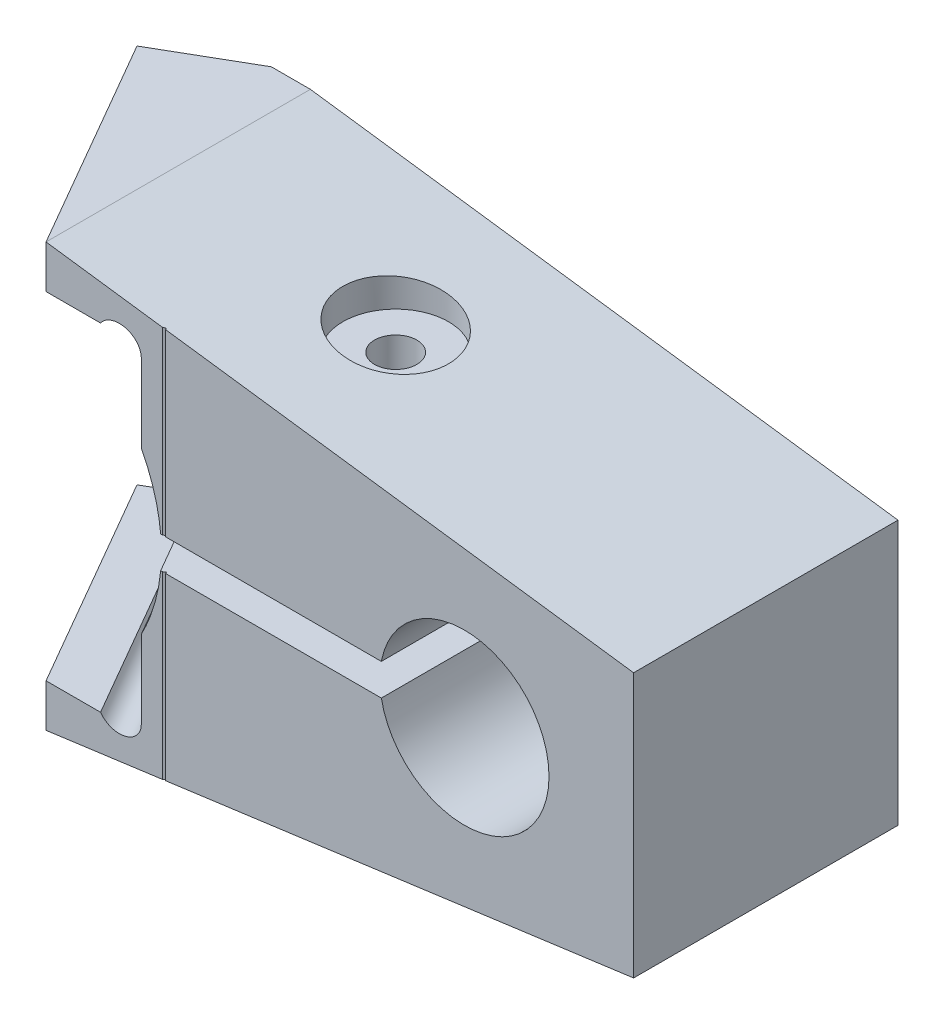
ISO-10303-21;
HEADER;
FILE_DESCRIPTION(('STEP AP214'),'2;1');
FILE_NAME('part.step','',(''),(''),'','','');
FILE_SCHEMA(('AUTOMOTIVE_DESIGN { 1 0 10303 214 1 1 1 1 }'));
ENDSEC;
DATA;
#1=APPLICATION_CONTEXT('core data for automotive mechanical design processes');
#2=APPLICATION_PROTOCOL_DEFINITION('international standard','automotive_design',2000,#1);
#3=PRODUCT_CONTEXT('',#1,'mechanical');
#4=PRODUCT('Part','Part','',(#3));
#5=PRODUCT_RELATED_PRODUCT_CATEGORY('part','',(#4));
#6=PRODUCT_DEFINITION_FORMATION('','',#4);
#7=PRODUCT_DEFINITION_CONTEXT('part definition',#1,'design');
#8=PRODUCT_DEFINITION('design','',#6,#7);
#9=PRODUCT_DEFINITION_SHAPE('','',#8);
#10=(LENGTH_UNIT() NAMED_UNIT(*) SI_UNIT(.MILLI.,.METRE.));
#11=(NAMED_UNIT(*) PLANE_ANGLE_UNIT() SI_UNIT($,.RADIAN.));
#12=(NAMED_UNIT(*) SI_UNIT($,.STERADIAN.) SOLID_ANGLE_UNIT());
#13=UNCERTAINTY_MEASURE_WITH_UNIT(LENGTH_MEASURE(1.E-05),#10,'distance_accuracy_value','');
#14=(GEOMETRIC_REPRESENTATION_CONTEXT(3) GLOBAL_UNCERTAINTY_ASSIGNED_CONTEXT((#13)) GLOBAL_UNIT_ASSIGNED_CONTEXT((#10,
#11,#12)) REPRESENTATION_CONTEXT('',''));
#15=CARTESIAN_POINT('',(0.,0.,0.));
#16=DIRECTION('',(0.,0.,1.));
#17=DIRECTION('',(1.,0.,0.));
#18=AXIS2_PLACEMENT_3D('',#15,#16,#17);
#19=CARTESIAN_POINT('',(-20.5662432702594,40.,12.5));
#20=DIRECTION('',(0.,0.,-1.));
#21=DIRECTION('',(-1.,0.,0.));
#22=AXIS2_PLACEMENT_3D('',#19,#20,#21);
#23=PLANE('',#22);
#24=DIRECTION('',(0.,-1.,0.));
#25=VECTOR('',#24,1.);
#26=CARTESIAN_POINT('',(-9.55957907090126,40.,12.5));
#27=LINE('',#26,#25);
#28=CARTESIAN_POINT('',(-9.55957907090126,38.5143861337956,12.5));
#29=VERTEX_POINT('',#28);
#30=CARTESIAN_POINT('',(-9.55957907090126,21.5,12.5));
#31=VERTEX_POINT('',#30);
#32=EDGE_CURVE('E256',#29,#31,#27,.T.);
#33=ORIENTED_EDGE('',*,*,#32,.F.);
#34=DIRECTION('',(0.99101360589069,-0.133761103985921,0.));
#35=VECTOR('',#34,1.);
#36=CARTESIAN_POINT('',(-20.5662432702594,40.,12.5));
#37=LINE('',#36,#35);
#38=CARTESIAN_POINT('',(-20.5662432702594,40.,12.5));
#39=VERTEX_POINT('',#38);
#40=EDGE_CURVE('E254',#39,#29,#37,.T.);
#41=ORIENTED_EDGE('',*,*,#40,.F.);
#42=DIRECTION('',(0.,-1.,0.));
#43=VECTOR('',#42,1.);
#44=CARTESIAN_POINT('',(-20.5662432702594,40.,12.5));
#45=LINE('',#44,#43);
#46=CARTESIAN_POINT('',(-20.5662432702594,35.9341201870565,12.5));
#47=VERTEX_POINT('',#46);
#48=EDGE_CURVE('E405',#39,#47,#45,.T.);
#49=ORIENTED_EDGE('',*,*,#48,.T.);
#50=DIRECTION('',(1.,0.,0.));
#51=VECTOR('',#50,1.);
#52=CARTESIAN_POINT('',(-20.5662432702594,35.9341201870565,12.5));
#53=LINE('',#52,#51);
#54=CARTESIAN_POINT('',(-15.4124508012529,35.9341201870565,12.5));
#55=VERTEX_POINT('',#54);
#56=EDGE_CURVE('E435',#47,#55,#53,.T.);
#57=ORIENTED_EDGE('',*,*,#56,.T.);
#58=CARTESIAN_POINT('',(-13.6380400399839,34.9967836211851,12.5));
#59=DIRECTION('',(0.,0.,-1.));
#60=DIRECTION('',(1.,0.,0.));
#61=AXIS2_PLACEMENT_3D('',#58,#59,#60);
#62=ELLIPSE('',#61,2.07846096908266,1.80000000000001);
#63=CARTESIAN_POINT('',(-11.5595790709013,34.9967836211851,12.5));
#64=VERTEX_POINT('',#63);
#65=EDGE_CURVE('E432',#55,#64,#62,.T.);
#66=ORIENTED_EDGE('',*,*,#65,.T.);
#67=DIRECTION('',(0.,-1.,0.));
#68=VECTOR('',#67,1.);
#69=CARTESIAN_POINT('',(-11.5595790709013,40.,12.5));
#70=LINE('',#69,#68);
#71=CARTESIAN_POINT('',(-11.5595790709013,27.6232179125168,12.5));
#72=VERTEX_POINT('',#71);
#73=EDGE_CURVE('E429',#64,#72,#70,.T.);
#74=ORIENTED_EDGE('',*,*,#73,.T.);
#75=CARTESIAN_POINT('',(-30.9585481156727,19.9967836211851,12.5));
#76=DIRECTION('',(0.,0.,-1.));
#77=DIRECTION('',(1.,0.,0.));
#78=AXIS2_PLACEMENT_3D('',#75,#76,#77);
#79=ELLIPSE('',#78,21.3042249330972,18.45);
#80=CARTESIAN_POINT('',(-9.72515176249161,21.5,12.5));
#81=VERTEX_POINT('',#80);
#82=EDGE_CURVE('E426',#72,#81,#79,.T.);
#83=ORIENTED_EDGE('',*,*,#82,.T.);
#84=DIRECTION('',(1.,0.,0.));
#85=VECTOR('',#84,1.);
#86=CARTESIAN_POINT('',(-20.5662432702594,21.5,12.5));
#87=LINE('',#86,#85);
#88=EDGE_CURVE('E350',#81,#31,#87,.T.);
#89=ORIENTED_EDGE('',*,*,#88,.T.);
#90=EDGE_LOOP('',(#33,#41,#49,#57,#66,#74,#83,#89));
#91=FACE_BOUND('',#90,.T.);
#92=ADVANCED_FACE('F32',(#91),#23,.F.);
#93=CARTESIAN_POINT('',(-9.55957907090128,18.5,12.5));
#94=VERTEX_POINT('',#93);
#95=CARTESIAN_POINT('',(-9.55957907090127,1.48561386620443,12.5));
#96=VERTEX_POINT('',#95);
#97=EDGE_CURVE('E239',#94,#96,#27,.T.);
#98=ORIENTED_EDGE('',*,*,#97,.F.);
#99=DIRECTION('',(-1.,0.,0.));
#100=VECTOR('',#99,1.);
#101=CARTESIAN_POINT('',(-20.5662432702594,18.5,12.5));
#102=LINE('',#101,#100);
#103=CARTESIAN_POINT('',(-9.72454586169798,18.5,12.5));
#104=VERTEX_POINT('',#103);
#105=EDGE_CURVE('E344',#94,#104,#102,.T.);
#106=ORIENTED_EDGE('',*,*,#105,.T.);
#107=CARTESIAN_POINT('',(-11.5595790709013,12.3703493298534,12.5));
#108=VERTEX_POINT('',#107);
#109=EDGE_CURVE('E425',#104,#108,#79,.T.);
#110=ORIENTED_EDGE('',*,*,#109,.T.);
#111=DIRECTION('',(0.,-1.,0.));
#112=VECTOR('',#111,1.);
#113=CARTESIAN_POINT('',(-11.5595790709013,40.,12.5));
#114=LINE('',#113,#112);
#115=CARTESIAN_POINT('',(-11.5595790709013,4.99678362118511,12.5));
#116=VERTEX_POINT('',#115);
#117=EDGE_CURVE('E422',#108,#116,#114,.T.);
#118=ORIENTED_EDGE('',*,*,#117,.T.);
#119=CARTESIAN_POINT('',(-13.6380400399839,4.99678362118511,12.5));
#120=DIRECTION('',(0.,0.,-1.));
#121=DIRECTION('',(1.,0.,0.));
#122=AXIS2_PLACEMENT_3D('',#119,#120,#121);
#123=ELLIPSE('',#122,2.07846096908266,1.80000000000001);
#124=CARTESIAN_POINT('',(-15.4124508012529,4.05944705531372,12.5));
#125=VERTEX_POINT('',#124);
#126=EDGE_CURVE('E419',#116,#125,#123,.T.);
#127=ORIENTED_EDGE('',*,*,#126,.T.);
#128=DIRECTION('',(-1.,0.,0.));
#129=VECTOR('',#128,1.);
#130=CARTESIAN_POINT('',(-20.5662432702594,4.05944705531372,12.5));
#131=LINE('',#130,#129);
#132=CARTESIAN_POINT('',(-20.5662432702594,4.05944705531371,12.5));
#133=VERTEX_POINT('',#132);
#134=EDGE_CURVE('E416',#125,#133,#131,.T.);
#135=ORIENTED_EDGE('',*,*,#134,.T.);
#136=CARTESIAN_POINT('',(-20.5662432702594,0.,12.5));
#137=VERTEX_POINT('',#136);
#138=EDGE_CURVE('E404',#133,#137,#45,.T.);
#139=ORIENTED_EDGE('',*,*,#138,.T.);
#140=DIRECTION('',(-0.99101360589069,-0.133761103985921,0.));
#141=VECTOR('',#140,1.);
#142=CARTESIAN_POINT('',(35.,7.5,12.5));
#143=LINE('',#142,#141);
#144=EDGE_CURVE('E373',#96,#137,#143,.T.);
#145=ORIENTED_EDGE('',*,*,#144,.F.);
#146=EDGE_LOOP('',(#98,#106,#110,#118,#127,#135,#139,#145));
#147=FACE_BOUND('',#146,.T.);
#148=ADVANCED_FACE('F491',(#147),#23,.F.);
#149=DIRECTION('',(0.,1.,0.));
#150=VECTOR('',#149,1.);
#151=CARTESIAN_POINT('',(-9.25017799414276,40.,12.5));
#152=LINE('',#151,#150);
#153=CARTESIAN_POINT('',(-9.25017799414278,1.52737497761163,12.5));
#154=VERTEX_POINT('',#153);
#155=CARTESIAN_POINT('',(-9.25017799414278,18.5,12.5));
#156=VERTEX_POINT('',#155);
#157=EDGE_CURVE('E55',#154,#156,#152,.T.);
#158=ORIENTED_EDGE('',*,*,#157,.F.);
#159=CARTESIAN_POINT('',(35.,7.5,12.5));
#160=VERTEX_POINT('',#159);
#161=EDGE_CURVE('E374',#160,#154,#143,.T.);
#162=ORIENTED_EDGE('',*,*,#161,.F.);
#163=DIRECTION('',(0.,-1.,0.));
#164=VECTOR('',#163,1.);
#165=CARTESIAN_POINT('',(35.,40.,12.5));
#166=LINE('',#165,#164);
#167=CARTESIAN_POINT('',(35.,32.5,12.5));
#168=VERTEX_POINT('',#167);
#169=EDGE_CURVE('E397',#168,#160,#166,.T.);
#170=ORIENTED_EDGE('',*,*,#169,.F.);
#171=CARTESIAN_POINT('',(-9.25017799414276,38.4726250223884,12.5));
#172=VERTEX_POINT('',#171);
#173=EDGE_CURVE('E382',#172,#168,#37,.T.);
#174=ORIENTED_EDGE('',*,*,#173,.F.);
#175=CARTESIAN_POINT('',(-9.25017799414277,21.5,12.5));
#176=VERTEX_POINT('',#175);
#177=EDGE_CURVE('E235',#176,#172,#152,.T.);
#178=ORIENTED_EDGE('',*,*,#177,.F.);
#179=CARTESIAN_POINT('',(11.1412752021686,21.5,12.5));
#180=VERTEX_POINT('',#179);
#181=EDGE_CURVE('E349',#176,#180,#87,.T.);
#182=ORIENTED_EDGE('',*,*,#181,.T.);
#183=CARTESIAN_POINT('',(19.,20.0031885382757,12.5));
#184=DIRECTION('',(0.,0.,-1.));
#185=DIRECTION('',(-1.,0.,0.));
#186=AXIS2_PLACEMENT_3D('',#183,#184,#185);
#187=CIRCLE('',#186,7.99999999999999);
#188=CARTESIAN_POINT('',(11.142492493265,18.5,12.5));
#189=VERTEX_POINT('',#188);
#190=EDGE_CURVE('E444',#180,#189,#187,.T.);
#191=ORIENTED_EDGE('',*,*,#190,.T.);
#192=EDGE_CURVE('E346',#189,#156,#102,.T.);
#193=ORIENTED_EDGE('',*,*,#192,.T.);
#194=EDGE_LOOP('',(#158,#162,#170,#174,#178,#182,#191,#193));
#195=FACE_BOUND('',#194,.T.);
#196=ADVANCED_FACE('F503',(#195),#23,.F.);
#197=CARTESIAN_POINT('',(-20.5662432702594,40.,-27.5));
#198=DIRECTION('',(-0.133761103985921,-0.99101360589069,0.));
#199=DIRECTION('',(0.99101360589069,-0.133761103985921,0.));
#200=AXIS2_PLACEMENT_3D('',#197,#198,#199);
#201=PLANE('',#200);
#202=CARTESIAN_POINT('',(0.,37.2240911847013,0.));
#203=DIRECTION('',(-0.133761103985921,-0.99101360589069,0.));
#204=DIRECTION('',(-0.99101360589069,0.133761103985921,0.));
#205=AXIS2_PLACEMENT_3D('',#202,#203,#204);
#206=ELLIPSE('',#205,5.04533940833856,5.);
#207=CARTESIAN_POINT('',(-4.99999999999999,37.8989613539443,0.));
#208=VERTEX_POINT('',#207);
#209=EDGE_CURVE('E295',#208,#208,#206,.T.);
#210=ORIENTED_EDGE('',*,*,#209,.T.);
#211=EDGE_LOOP('',(#210));
#212=FACE_BOUND('',#211,.T.);
#213=DIRECTION('',(-0.860168885537521,0.116100464272061,0.496618737613626));
#214=VECTOR('',#213,1.);
#215=CARTESIAN_POINT('',(-0.764628358790168,37.3272961586822,7.42223283885319));
#216=LINE('',#215,#214);
#217=CARTESIAN_POINT('',(-9.32752826333239,38.4830653002402,12.3660254037844));
#218=VERTEX_POINT('',#217);
#219=EDGE_CURVE('E243',#218,#29,#216,.T.);
#220=ORIENTED_EDGE('',*,*,#219,.F.);
#221=DIRECTION('',(-0.498865250329703,0.0673338551838957,-0.864059959701615));
#222=VECTOR('',#221,1.);
#223=CARTESIAN_POINT('',(-29.3596528274263,41.1868819592137,-22.330632124775));
#224=LINE('',#223,#222);
#225=EDGE_CURVE('E232',#172,#218,#224,.T.);
#226=ORIENTED_EDGE('',*,*,#225,.F.);
#227=ORIENTED_EDGE('',*,*,#173,.T.);
#228=DIRECTION('',(0.,0.,1.));
#229=VECTOR('',#228,1.);
#230=CARTESIAN_POINT('',(35.,32.5,-27.5));
#231=LINE('',#230,#229);
#232=CARTESIAN_POINT('',(35.,32.5,-12.5));
#233=VERTEX_POINT('',#232);
#234=EDGE_CURVE('E384',#233,#168,#231,.T.);
#235=ORIENTED_EDGE('',*,*,#234,.F.);
#236=DIRECTION('',(0.99101360589069,-0.133761103985921,0.));
#237=VECTOR('',#236,1.);
#238=CARTESIAN_POINT('',(-34.7417507491503,41.913325426277,-12.5));
#239=LINE('',#238,#237);
#240=CARTESIAN_POINT('',(-20.5662432702594,40.,-12.5));
#241=VERTEX_POINT('',#240);
#242=EDGE_CURVE('E387',#241,#233,#239,.T.);
#243=ORIENTED_EDGE('',*,*,#242,.F.);
#244=DIRECTION('',(0.,0.,-1.));
#245=VECTOR('',#244,1.);
#246=CARTESIAN_POINT('',(-20.5662432702594,40.,0.));
#247=LINE('',#246,#245);
#248=EDGE_CURVE('E411',#39,#241,#247,.T.);
#249=ORIENTED_EDGE('',*,*,#248,.F.);
#250=ORIENTED_EDGE('',*,*,#40,.T.);
#251=EDGE_LOOP('',(#220,#226,#227,#235,#243,#249,#250));
#252=FACE_BOUND('',#251,.T.);
#253=ADVANCED_FACE('F251',(#212,#252),#201,.F.);
#254=CARTESIAN_POINT('',(35.,7.5,-27.5));
#255=DIRECTION('',(-0.133761103985921,0.99101360589069,0.));
#256=DIRECTION('',(-0.99101360589069,-0.133761103985921,0.));
#257=AXIS2_PLACEMENT_3D('',#254,#255,#256);
#258=PLANE('',#257);
#259=DIRECTION('',(0.990509628500006,0.133693080124532,0.031887868784157));
#260=VECTOR('',#259,1.);
#261=CARTESIAN_POINT('',(33.988371149221,7.36345637325272,4.49596254307045));
#262=LINE('',#261,#260);
#263=CARTESIAN_POINT('',(-2.07137533789319,2.49632693032874,3.33507684212841));
#264=VERTEX_POINT('',#263);
#265=CARTESIAN_POINT('',(1.85257359990979,3.02595814707997,3.46140208445229));
#266=VERTEX_POINT('',#265);
#267=EDGE_CURVE('E447',#264,#266,#262,.T.);
#268=ORIENTED_EDGE('',*,*,#267,.T.);
#269=DIRECTION('',(0.526274193536715,0.0710333508120736,-0.84734275018418));
#270=VECTOR('',#269,1.);
#271=CARTESIAN_POINT('',(25.0072492109914,6.15123811676364,-33.8194426783599));
#272=LINE('',#271,#270);
#273=CARTESIAN_POINT('',(3.92394893780298,3.30554003204994,0.126325242323875));
#274=VERTEX_POINT('',#273);
#275=EDGE_CURVE('E466',#266,#274,#272,.T.);
#276=ORIENTED_EDGE('',*,*,#275,.T.);
#277=DIRECTION('',(-0.470921048982029,-0.0635621136053225,-0.87988250541745));
#278=VECTOR('',#277,1.);
#279=CARTESIAN_POINT('',(-0.505979452486573,2.70761472755209,-8.15068106116077));
#280=LINE('',#279,#278);
#281=CARTESIAN_POINT('',(2.07137533789319,3.05549070026868,-3.33507684212841));
#282=VERTEX_POINT('',#281);
#283=EDGE_CURVE('E463',#274,#282,#280,.T.);
#284=ORIENTED_EDGE('',*,*,#283,.T.);
#285=DIRECTION('',(-0.990509628500006,-0.133693080124532,-0.0318878687841571));
#286=VECTOR('',#285,1.);
#287=CARTESIAN_POINT('',(34.2032620600195,7.39246106632059,-2.30064228631879));
#288=LINE('',#287,#286);
#289=CARTESIAN_POINT('',(-1.85257359990978,2.52585948351744,-3.46140208445228));
#290=VERTEX_POINT('',#289);
#291=EDGE_CURVE('E460',#282,#290,#288,.T.);
#292=ORIENTED_EDGE('',*,*,#291,.T.);
#293=DIRECTION('',(-0.526274193536715,-0.0710333508120736,0.84734275018418));
#294=VECTOR('',#293,1.);
#295=CARTESIAN_POINT('',(19.2598734863602,5.37549163116661,-37.4540986614506));
#296=LINE('',#295,#294);
#297=CARTESIAN_POINT('',(-3.92394893780298,2.24627759854748,-0.126325242323872));
#298=VERTEX_POINT('',#297);
#299=EDGE_CURVE('E457',#290,#298,#296,.T.);
#300=ORIENTED_EDGE('',*,*,#299,.T.);
#301=DIRECTION('',(0.470921048982029,0.0635621136053225,0.87988250541745));
#302=VECTOR('',#301,1.);
#303=CARTESIAN_POINT('',(-6.47708176505837,1.90167096190152,-4.89667244503456));
#304=LINE('',#303,#302);
#305=EDGE_CURVE('E454',#298,#264,#304,.T.);
#306=ORIENTED_EDGE('',*,*,#305,.T.);
#307=EDGE_LOOP('',(#268,#276,#284,#292,#300,#306));
#308=FACE_BOUND('',#307,.T.);
#309=DIRECTION('',(0.860168885537521,0.116100464272061,-0.496618737613626));
#310=VECTOR('',#309,1.);
#311=CARTESIAN_POINT('',(41.0973028569607,8.32297756220062,-16.746764417358));
#312=LINE('',#311,#310);
#313=CARTESIAN_POINT('',(-9.3275282633324,1.51693469975983,12.3660254037844));
#314=VERTEX_POINT('',#313);
#315=EDGE_CURVE('E484',#96,#314,#312,.T.);
#316=ORIENTED_EDGE('',*,*,#315,.F.);
#317=ORIENTED_EDGE('',*,*,#144,.T.);
#318=DIRECTION('',(0.,0.,-1.));
#319=VECTOR('',#318,1.);
#320=CARTESIAN_POINT('',(-20.5662432702594,0.,0.));
#321=LINE('',#320,#319);
#322=CARTESIAN_POINT('',(-20.5662432702594,0.,-12.5));
#323=VERTEX_POINT('',#322);
#324=EDGE_CURVE('E414',#137,#323,#321,.T.);
#325=ORIENTED_EDGE('',*,*,#324,.T.);
#326=DIRECTION('',(-0.99101360589069,-0.133761103985921,0.));
#327=VECTOR('',#326,1.);
#328=CARTESIAN_POINT('',(-29.43938778959,-1.19764410869572,-12.5));
#329=LINE('',#328,#327);
#330=CARTESIAN_POINT('',(35.,7.5,-12.5));
#331=VERTEX_POINT('',#330);
#332=EDGE_CURVE('E379',#331,#323,#329,.T.);
#333=ORIENTED_EDGE('',*,*,#332,.F.);
#334=DIRECTION('',(0.,0.,1.));
#335=VECTOR('',#334,1.);
#336=CARTESIAN_POINT('',(35.,7.5,-27.5));
#337=LINE('',#336,#335);
#338=EDGE_CURVE('E377',#331,#160,#337,.T.);
#339=ORIENTED_EDGE('',*,*,#338,.T.);
#340=ORIENTED_EDGE('',*,*,#161,.T.);
#341=DIRECTION('',(0.498865250329703,0.0673338551838957,0.864059959701615));
#342=VECTOR('',#341,1.);
#343=CARTESIAN_POINT('',(-15.2791453319255,0.713620936089596,2.05752225378708));
#344=LINE('',#343,#342);
#345=EDGE_CURVE('E498',#314,#154,#344,.T.);
#346=ORIENTED_EDGE('',*,*,#345,.F.);
#347=EDGE_LOOP('',(#316,#317,#325,#333,#339,#340,#346));
#348=FACE_BOUND('',#347,.T.);
#349=ADVANCED_FACE('F505',(#308,#348),#258,.F.);
#350=CARTESIAN_POINT('',(11.1412752021686,21.5,27.5));
#351=DIRECTION('',(0.,1.,0.));
#352=DIRECTION('',(0.,0.,1.));
#353=AXIS2_PLACEMENT_3D('',#350,#351,#352);
#354=PLANE('',#353);
#355=CARTESIAN_POINT('',(0.,21.5,0.));
#356=DIRECTION('',(0.,1.,0.));
#357=DIRECTION('',(0.,0.,1.));
#358=AXIS2_PLACEMENT_3D('',#355,#356,#357);
#359=CIRCLE('',#358,2.);
#360=CARTESIAN_POINT('',(0.,21.5,2.));
#361=VERTEX_POINT('',#360);
#362=EDGE_CURVE('E328',#361,#361,#359,.T.);
#363=ORIENTED_EDGE('',*,*,#362,.T.);
#364=EDGE_LOOP('',(#363));
#365=FACE_BOUND('',#364,.T.);
#366=DIRECTION('',(0.86602540378444,0.,-0.499999999999998));
#367=VECTOR('',#366,1.);
#368=CARTESIAN_POINT('',(-0.529128894482096,21.5,7.28626715974092));
#369=LINE('',#368,#367);
#370=CARTESIAN_POINT('',(-9.3275282633324,21.5,12.3660254037844));
#371=VERTEX_POINT('',#370);
#372=EDGE_CURVE('E246',#31,#371,#369,.T.);
#373=ORIENTED_EDGE('',*,*,#372,.F.);
#374=ORIENTED_EDGE('',*,*,#88,.F.);
#375=DIRECTION('',(0.499999999999998,0.,0.86602540378444));
#376=VECTOR('',#375,1.);
#377=CARTESIAN_POINT('',(-33.5967898818501,21.5,-28.8468900826271));
#378=LINE('',#377,#376);
#379=CARTESIAN_POINT('',(-24.1589084922322,21.5,-12.5));
#380=VERTEX_POINT('',#379);
#381=EDGE_CURVE('E441',#380,#81,#378,.T.);
#382=ORIENTED_EDGE('',*,*,#381,.F.);
#383=DIRECTION('',(1.,0.,0.));
#384=VECTOR('',#383,1.);
#385=CARTESIAN_POINT('',(11.1412752021686,21.5,-12.5));
#386=LINE('',#385,#384);
#387=CARTESIAN_POINT('',(11.1412752021686,21.5,-12.5));
#388=VERTEX_POINT('',#387);
#389=EDGE_CURVE('E338',#380,#388,#386,.T.);
#390=ORIENTED_EDGE('',*,*,#389,.T.);
#391=DIRECTION('',(0.,0.,-1.));
#392=VECTOR('',#391,1.);
#393=CARTESIAN_POINT('',(11.1412752021686,21.5,27.5));
#394=LINE('',#393,#392);
#395=EDGE_CURVE('E342',#180,#388,#394,.T.);
#396=ORIENTED_EDGE('',*,*,#395,.F.);
#397=ORIENTED_EDGE('',*,*,#181,.F.);
#398=DIRECTION('',(0.499999999999998,0.,0.86602540378444));
#399=VECTOR('',#398,1.);
#400=CARTESIAN_POINT('',(2.34287583331831,21.5,32.5797582440435));
#401=LINE('',#400,#399);
#402=EDGE_CURVE('E496',#371,#176,#401,.T.);
#403=ORIENTED_EDGE('',*,*,#402,.F.);
#404=EDGE_LOOP('',(#373,#374,#382,#390,#396,#397,#403));
#405=FACE_BOUND('',#404,.T.);
#406=ADVANCED_FACE('F526',(#365,#405),#354,.F.);
#407=CARTESIAN_POINT('',(-29.874932974991,18.5,27.5));
#408=DIRECTION('',(0.,-1.,0.));
#409=DIRECTION('',(1.,0.,0.));
#410=AXIS2_PLACEMENT_3D('',#407,#408,#409);
#411=PLANE('',#410);
#412=CARTESIAN_POINT('',(0.,18.5,0.));
#413=DIRECTION('',(0.,-1.,0.));
#414=DIRECTION('',(1.,0.,0.));
#415=AXIS2_PLACEMENT_3D('',#412,#413,#414);
#416=CIRCLE('',#415,2.);
#417=CARTESIAN_POINT('',(2.,18.5,0.));
#418=VERTEX_POINT('',#417);
#419=EDGE_CURVE('E332',#418,#418,#416,.T.);
#420=ORIENTED_EDGE('',*,*,#419,.T.);
#421=EDGE_LOOP('',(#420));
#422=FACE_BOUND('',#421,.T.);
#423=DIRECTION('',(-0.86602540378444,0.,0.499999999999998));
#424=VECTOR('',#423,1.);
#425=CARTESIAN_POINT('',(-31.2912850273519,18.5,25.0468062839065));
#426=LINE('',#425,#424);
#427=CARTESIAN_POINT('',(-9.32752826333239,18.5,12.3660254037844));
#428=VERTEX_POINT('',#427);
#429=EDGE_CURVE('E11',#428,#94,#426,.T.);
#430=ORIENTED_EDGE('',*,*,#429,.F.);
#431=DIRECTION('',(-0.499999999999998,0.,-0.86602540378444));
#432=VECTOR('',#431,1.);
#433=CARTESIAN_POINT('',(-7.91117621097152,18.5,14.8192191198779));
#434=LINE('',#433,#432);
#435=EDGE_CURVE('E40',#156,#428,#434,.T.);
#436=ORIENTED_EDGE('',*,*,#435,.F.);
#437=ORIENTED_EDGE('',*,*,#192,.F.);
#438=DIRECTION('',(0.,0.,-1.));
#439=VECTOR('',#438,1.);
#440=CARTESIAN_POINT('',(11.142492493265,18.5,27.5));
#441=LINE('',#440,#439);
#442=CARTESIAN_POINT('',(11.142492493265,18.5,-12.5));
#443=VERTEX_POINT('',#442);
#444=EDGE_CURVE('E341',#189,#443,#441,.T.);
#445=ORIENTED_EDGE('',*,*,#444,.T.);
#446=DIRECTION('',(-1.,0.,0.));
#447=VECTOR('',#446,1.);
#448=CARTESIAN_POINT('',(-29.874932974991,18.5,-12.5));
#449=LINE('',#448,#447);
#450=CARTESIAN_POINT('',(-24.1583025914386,18.5,-12.5));
#451=VERTEX_POINT('',#450);
#452=EDGE_CURVE('E335',#443,#451,#449,.T.);
#453=ORIENTED_EDGE('',*,*,#452,.T.);
#454=DIRECTION('',(0.499999999999998,0.,0.86602540378444));
#455=VECTOR('',#454,1.);
#456=CARTESIAN_POINT('',(-33.5963354562549,18.5,-28.8471524453668));
#457=LINE('',#456,#455);
#458=EDGE_CURVE('E438',#104,#451,#457,.F.);
#459=ORIENTED_EDGE('',*,*,#458,.F.);
#460=ORIENTED_EDGE('',*,*,#105,.F.);
#461=EDGE_LOOP('',(#430,#436,#437,#445,#453,#459,#460));
#462=FACE_BOUND('',#461,.T.);
#463=ADVANCED_FACE('F486',(#422,#462),#411,.F.);
#464=CARTESIAN_POINT('',(-49.5218371467359,19.9967836211851,-19.6525597573878));
#465=DIRECTION('',(0.499999999999998,0.,0.86602540378444));
#466=DIRECTION('',(0.86602540378444,0.,-0.499999999999998));
#467=AXIS2_PLACEMENT_3D('',#464,#465,#466);
#468=CYLINDRICAL_SURFACE('',#467,18.45);
#469=CARTESIAN_POINT('',(-40.1088058544798,19.9967836211851,-3.34871130596435));
#470=DIRECTION('',(-0.499999999999998,0.,-0.86602540378444));
#471=DIRECTION('',(-0.86602540378444,0.,0.499999999999998));
#472=AXIS2_PLACEMENT_3D('',#469,#470,#471);
#473=CIRCLE('',#472,18.45);
#474=CARTESIAN_POINT('',(-24.2583088816793,22.3244779640184,-12.5));
#475=VERTEX_POINT('',#474);
#476=CARTESIAN_POINT('',(-25.5595790709012,27.6232179125168,-11.7487113059643));
#477=VERTEX_POINT('',#476);
#478=EDGE_CURVE('E283',#475,#477,#473,.F.);
#479=ORIENTED_EDGE('',*,*,#478,.F.);
#480=CARTESIAN_POINT('',(-45.3923048454132,19.9967836211851,-12.5));
#481=DIRECTION('',(0.,0.,1.));
#482=DIRECTION('',(1.,0.,0.));
#483=AXIS2_PLACEMENT_3D('',#480,#481,#482);
#484=ELLIPSE('',#483,21.3042249330972,18.45);
#485=EDGE_CURVE('E368',#380,#475,#484,.T.);
#486=ORIENTED_EDGE('',*,*,#485,.F.);
#487=ORIENTED_EDGE('',*,*,#381,.T.);
#488=ORIENTED_EDGE('',*,*,#82,.F.);
#489=DIRECTION('',(0.499999999999998,0.,0.86602540378444));
#490=VECTOR('',#489,1.);
#491=CARTESIAN_POINT('',(-34.9726103631574,27.6232179125168,-28.0525597573878));
#492=LINE('',#491,#490);
#493=EDGE_CURVE('E359',#477,#72,#492,.T.);
#494=ORIENTED_EDGE('',*,*,#493,.F.);
#495=EDGE_LOOP('',(#479,#486,#487,#488,#494));
#496=FACE_BOUND('',#495,.T.);
#497=ADVANCED_FACE('F622',(#496),#468,.F.);
#498=CARTESIAN_POINT('',(-35.,40.,-12.5));
#499=DIRECTION('',(0.86602540378444,0.,-0.499999999999998));
#500=DIRECTION('',(-0.499999999999998,0.,-0.86602540378444));
#501=AXIS2_PLACEMENT_3D('',#498,#499,#500);
#502=PLANE('',#501);
#503=DIRECTION('',(0.,1.,0.));
#504=VECTOR('',#503,1.);
#505=CARTESIAN_POINT('',(-32.3145772204198,40.,-7.84871130596433));
#506=LINE('',#505,#504);
#507=CARTESIAN_POINT('',(-32.3145772204198,35.9341201870565,-7.84871130596433));
#508=VERTEX_POINT('',#507);
#509=CARTESIAN_POINT('',(-32.3145772204198,40.,-7.84871130596433));
#510=VERTEX_POINT('',#509);
#511=EDGE_CURVE('E281',#508,#510,#506,.T.);
#512=ORIENTED_EDGE('',*,*,#511,.F.);
#513=DIRECTION('',(0.499999999999998,0.,0.86602540378444));
#514=VECTOR('',#513,1.);
#515=CARTESIAN_POINT('',(-35.,35.9341201870565,-12.5));
#516=LINE('',#515,#514);
#517=EDGE_CURVE('E371',#508,#47,#516,.T.);
#518=ORIENTED_EDGE('',*,*,#517,.T.);
#519=ORIENTED_EDGE('',*,*,#48,.F.);
#520=DIRECTION('',(0.499999999999998,0.,0.86602540378444));
#521=VECTOR('',#520,1.);
#522=CARTESIAN_POINT('',(-35.,40.,-12.5));
#523=LINE('',#522,#521);
#524=EDGE_CURVE('E394',#510,#39,#523,.T.);
#525=ORIENTED_EDGE('',*,*,#524,.F.);
#526=EDGE_LOOP('',(#512,#518,#519,#525));
#527=FACE_BOUND('',#526,.T.);
#528=ADVANCED_FACE('F521',(#527),#502,.F.);
#529=DIRECTION('',(0.,1.,0.));
#530=VECTOR('',#529,1.);
#531=CARTESIAN_POINT('',(-32.3145772204198,40.,-7.84871130596433));
#532=LINE('',#531,#530);
#533=CARTESIAN_POINT('',(-32.3145772204198,0.,-7.84871130596434));
#534=VERTEX_POINT('',#533);
#535=CARTESIAN_POINT('',(-32.3145772204198,4.05944705531372,-7.84871130596434));
#536=VERTEX_POINT('',#535);
#537=EDGE_CURVE('E269',#534,#536,#532,.T.);
#538=ORIENTED_EDGE('',*,*,#537,.F.);
#539=DIRECTION('',(0.499999999999998,0.,0.86602540378444));
#540=VECTOR('',#539,1.);
#541=CARTESIAN_POINT('',(-35.,0.,-12.5));
#542=LINE('',#541,#540);
#543=EDGE_CURVE('E395',#534,#137,#542,.T.);
#544=ORIENTED_EDGE('',*,*,#543,.T.);
#545=ORIENTED_EDGE('',*,*,#138,.F.);
#546=DIRECTION('',(-0.499999999999998,0.,-0.86602540378444));
#547=VECTOR('',#546,1.);
#548=CARTESIAN_POINT('',(-35.,4.05944705531372,-12.5));
#549=LINE('',#548,#547);
#550=EDGE_CURVE('E356',#133,#536,#549,.T.);
#551=ORIENTED_EDGE('',*,*,#550,.T.);
#552=EDGE_LOOP('',(#538,#544,#545,#551));
#553=FACE_BOUND('',#552,.T.);
#554=ADVANCED_FACE('F560',(#553),#502,.F.);
#555=CARTESIAN_POINT('',(-35.,40.,-12.5));
#556=DIRECTION('',(0.,0.,1.));
#557=DIRECTION('',(1.,0.,0.));
#558=AXIS2_PLACEMENT_3D('',#555,#556,#557);
#559=PLANE('',#558);
#560=DIRECTION('',(0.,-1.,0.));
#561=VECTOR('',#560,1.);
#562=CARTESIAN_POINT('',(-24.2583088816793,40.,-12.5));
#563=LINE('',#562,#561);
#564=CARTESIAN_POINT('',(-24.2583088816793,40.,-12.5));
#565=VERTEX_POINT('',#564);
#566=EDGE_CURVE('E270',#565,#475,#563,.T.);
#567=ORIENTED_EDGE('',*,*,#566,.F.);
#568=DIRECTION('',(-1.,0.,0.));
#569=VECTOR('',#568,1.);
#570=CARTESIAN_POINT('',(-35.,40.,-12.5));
#571=LINE('',#570,#569);
#572=EDGE_CURVE('E391',#241,#565,#571,.T.);
#573=ORIENTED_EDGE('',*,*,#572,.F.);
#574=ORIENTED_EDGE('',*,*,#242,.T.);
#575=DIRECTION('',(0.,-1.,0.));
#576=VECTOR('',#575,1.);
#577=CARTESIAN_POINT('',(35.,40.,-12.5));
#578=LINE('',#577,#576);
#579=EDGE_CURVE('E408',#233,#331,#578,.T.);
#580=ORIENTED_EDGE('',*,*,#579,.T.);
#581=ORIENTED_EDGE('',*,*,#332,.T.);
#582=DIRECTION('',(-1.,0.,0.));
#583=VECTOR('',#582,1.);
#584=CARTESIAN_POINT('',(-35.,0.,-12.5));
#585=LINE('',#584,#583);
#586=CARTESIAN_POINT('',(-24.2583088816793,0.,-12.5));
#587=VERTEX_POINT('',#586);
#588=EDGE_CURVE('E390',#323,#587,#585,.T.);
#589=ORIENTED_EDGE('',*,*,#588,.T.);
#590=CARTESIAN_POINT('',(-24.2583088816793,17.6690892783518,-12.5));
#591=VERTEX_POINT('',#590);
#592=EDGE_CURVE('E267',#591,#587,#563,.T.);
#593=ORIENTED_EDGE('',*,*,#592,.F.);
#594=EDGE_CURVE('E369',#591,#451,#484,.T.);
#595=ORIENTED_EDGE('',*,*,#594,.T.);
#596=ORIENTED_EDGE('',*,*,#452,.F.);
#597=CARTESIAN_POINT('',(19.,20.0031885382757,-12.5));
#598=DIRECTION('',(0.,0.,-1.));
#599=DIRECTION('',(-1.,0.,0.));
#600=AXIS2_PLACEMENT_3D('',#597,#598,#599);
#601=CIRCLE('',#600,7.99999999999999);
#602=EDGE_CURVE('E331',#388,#443,#601,.T.);
#603=ORIENTED_EDGE('',*,*,#602,.F.);
#604=ORIENTED_EDGE('',*,*,#389,.F.);
#605=ORIENTED_EDGE('',*,*,#485,.T.);
#606=EDGE_LOOP('',(#567,#573,#574,#580,#581,#589,#593,#595,#596,#603,#604,#605));
#607=FACE_BOUND('',#606,.T.);
#608=ADVANCED_FACE('F511',(#607),#559,.F.);
#609=CARTESIAN_POINT('',(0.,40.,0.));
#610=DIRECTION('',(0.,-1.,0.));
#611=DIRECTION('',(0.,0.,-1.));
#612=AXIS2_PLACEMENT_3D('',#609,#610,#611);
#613=PLANE('',#612);
#614=DIRECTION('',(0.86602540378444,0.,-0.499999999999998));
#615=VECTOR('',#614,1.);
#616=CARTESIAN_POINT('',(-11.4772359940725,40.,-19.879155872192));
#617=LINE('',#616,#615);
#618=EDGE_CURVE('E285',#510,#565,#617,.T.);
#619=ORIENTED_EDGE('',*,*,#618,.F.);
#620=ORIENTED_EDGE('',*,*,#524,.T.);
#621=ORIENTED_EDGE('',*,*,#248,.T.);
#622=ORIENTED_EDGE('',*,*,#572,.T.);
#623=EDGE_LOOP('',(#619,#620,#621,#622));
#624=FACE_BOUND('',#623,.T.);
#625=ADVANCED_FACE('F516',(#624),#613,.F.);
#626=CARTESIAN_POINT('',(0.,0.,0.));
#627=DIRECTION('',(0.,-1.,0.));
#628=DIRECTION('',(0.,0.,-1.));
#629=AXIS2_PLACEMENT_3D('',#626,#627,#628);
#630=PLANE('',#629);
#631=ORIENTED_EDGE('',*,*,#543,.F.);
#632=DIRECTION('',(0.86602540378444,0.,-0.499999999999998));
#633=VECTOR('',#632,1.);
#634=CARTESIAN_POINT('',(-11.4772359940725,0.,-19.879155872192));
#635=LINE('',#634,#633);
#636=EDGE_CURVE('E272',#534,#587,#635,.T.);
#637=ORIENTED_EDGE('',*,*,#636,.T.);
#638=ORIENTED_EDGE('',*,*,#588,.F.);
#639=ORIENTED_EDGE('',*,*,#324,.F.);
#640=EDGE_LOOP('',(#631,#637,#638,#639));
#641=FACE_BOUND('',#640,.T.);
#642=ADVANCED_FACE('F564',(#641),#630,.T.);
#643=CARTESIAN_POINT('',(-42.7668389972173,35.9341201870565,-23.5525597573878));
#644=DIRECTION('',(0.,1.,0.));
#645=DIRECTION('',(0.,0.,1.));
#646=AXIS2_PLACEMENT_3D('',#643,#644,#645);
#647=PLANE('',#646);
#648=DIRECTION('',(-0.86602540378444,0.,0.499999999999998));
#649=VECTOR('',#648,1.);
#650=CARTESIAN_POINT('',(-33.3538077049612,35.9341201870565,-7.24871130596433));
#651=LINE('',#650,#649);
#652=CARTESIAN_POINT('',(-28.449232868665,35.9341201870565,-10.0803689079606));
#653=VERTEX_POINT('',#652);
#654=EDGE_CURVE('E279',#653,#508,#651,.T.);
#655=ORIENTED_EDGE('',*,*,#654,.F.);
#656=DIRECTION('',(0.499999999999998,0.,0.86602540378444));
#657=VECTOR('',#656,1.);
#658=CARTESIAN_POINT('',(-37.8622641609211,35.9341201870565,-26.384217359384));
#659=LINE('',#658,#657);
#660=EDGE_CURVE('E354',#653,#55,#659,.T.);
#661=ORIENTED_EDGE('',*,*,#660,.T.);
#662=ORIENTED_EDGE('',*,*,#56,.F.);
#663=ORIENTED_EDGE('',*,*,#517,.F.);
#664=EDGE_LOOP('',(#655,#661,#662,#663));
#665=FACE_BOUND('',#664,.T.);
#666=ADVANCED_FACE('F602',(#665),#647,.F.);
#667=CARTESIAN_POINT('',(-36.5314560899694,34.9967836211851,-27.1525597573878));
#668=DIRECTION('',(0.499999999999998,0.,0.86602540378444));
#669=DIRECTION('',(0.86602540378444,0.,-0.499999999999998));
#670=AXIS2_PLACEMENT_3D('',#667,#668,#669);
#671=CYLINDRICAL_SURFACE('',#670,1.80000000000001);
#672=CARTESIAN_POINT('',(-27.1184247977132,34.9967836211851,-10.8487113059643));
#673=DIRECTION('',(-0.499999999999998,0.,-0.86602540378444));
#674=DIRECTION('',(-0.86602540378444,0.,0.499999999999998));
#675=AXIS2_PLACEMENT_3D('',#672,#673,#674);
#676=CIRCLE('',#675,1.80000000000001);
#677=CARTESIAN_POINT('',(-25.5595790709012,34.9967836211851,-11.7487113059643));
#678=VERTEX_POINT('',#677);
#679=EDGE_CURVE('E277',#678,#653,#676,.F.);
#680=ORIENTED_EDGE('',*,*,#679,.F.);
#681=DIRECTION('',(0.499999999999998,0.,0.86602540378444));
#682=VECTOR('',#681,1.);
#683=CARTESIAN_POINT('',(-34.9726103631574,34.9967836211851,-28.0525597573878));
#684=LINE('',#683,#682);
#685=EDGE_CURVE('E357',#678,#64,#684,.T.);
#686=ORIENTED_EDGE('',*,*,#685,.T.);
#687=ORIENTED_EDGE('',*,*,#65,.F.);
#688=ORIENTED_EDGE('',*,*,#660,.F.);
#689=EDGE_LOOP('',(#680,#686,#687,#688));
#690=FACE_BOUND('',#689,.T.);
#691=ADVANCED_FACE('F606',(#690),#671,.F.);
#692=CARTESIAN_POINT('',(-34.9726103631574,34.9967836211851,-28.0525597573878));
#693=DIRECTION('',(0.86602540378444,0.,-0.499999999999998));
#694=DIRECTION('',(-0.499999999999998,0.,-0.86602540378444));
#695=AXIS2_PLACEMENT_3D('',#692,#693,#694);
#696=PLANE('',#695);
#697=DIRECTION('',(0.,1.,0.));
#698=VECTOR('',#697,1.);
#699=CARTESIAN_POINT('',(-25.5595790709012,34.9967836211851,-11.7487113059643));
#700=LINE('',#699,#698);
#701=EDGE_CURVE('E275',#477,#678,#700,.T.);
#702=ORIENTED_EDGE('',*,*,#701,.F.);
#703=ORIENTED_EDGE('',*,*,#493,.T.);
#704=ORIENTED_EDGE('',*,*,#73,.F.);
#705=ORIENTED_EDGE('',*,*,#685,.F.);
#706=EDGE_LOOP('',(#702,#703,#704,#705));
#707=FACE_BOUND('',#706,.T.);
#708=ADVANCED_FACE('F612',(#707),#696,.F.);
#709=CARTESIAN_POINT('',(-40.1088058544798,19.9967836211851,-3.34871130596435));
#710=DIRECTION('',(-0.499999999999998,0.,-0.86602540378444));
#711=DIRECTION('',(-0.86602540378444,0.,0.499999999999998));
#712=AXIS2_PLACEMENT_3D('',#709,#710,#711);
#713=CIRCLE('',#712,18.45);
#714=CARTESIAN_POINT('',(-25.5595790709012,12.3703493298534,-11.7487113059643));
#715=VERTEX_POINT('',#714);
#716=EDGE_CURVE('E265',#715,#591,#713,.F.);
#717=ORIENTED_EDGE('',*,*,#716,.F.);
#718=DIRECTION('',(0.499999999999998,0.,0.86602540378444));
#719=VECTOR('',#718,1.);
#720=CARTESIAN_POINT('',(-34.9726103631574,12.3703493298534,-28.0525597573878));
#721=LINE('',#720,#719);
#722=EDGE_CURVE('E361',#715,#108,#721,.T.);
#723=ORIENTED_EDGE('',*,*,#722,.T.);
#724=ORIENTED_EDGE('',*,*,#109,.F.);
#725=ORIENTED_EDGE('',*,*,#458,.T.);
#726=ORIENTED_EDGE('',*,*,#594,.F.);
#727=EDGE_LOOP('',(#717,#723,#724,#725,#726));
#728=FACE_BOUND('',#727,.T.);
#729=ADVANCED_FACE('F542',(#728),#468,.F.);
#730=CARTESIAN_POINT('',(-34.9726103631574,4.99678362118511,-28.0525597573878));
#731=DIRECTION('',(0.86602540378444,0.,-0.499999999999998));
#732=DIRECTION('',(-0.499999999999998,0.,-0.86602540378444));
#733=AXIS2_PLACEMENT_3D('',#730,#731,#732);
#734=PLANE('',#733);
#735=DIRECTION('',(0.,1.,0.));
#736=VECTOR('',#735,1.);
#737=CARTESIAN_POINT('',(-25.5595790709012,4.99678362118511,-11.7487113059643));
#738=LINE('',#737,#736);
#739=CARTESIAN_POINT('',(-25.5595790709012,4.99678362118511,-11.7487113059643));
#740=VERTEX_POINT('',#739);
#741=EDGE_CURVE('E258',#740,#715,#738,.T.);
#742=ORIENTED_EDGE('',*,*,#741,.F.);
#743=DIRECTION('',(0.499999999999998,0.,0.86602540378444));
#744=VECTOR('',#743,1.);
#745=CARTESIAN_POINT('',(-34.9726103631574,4.99678362118511,-28.0525597573878));
#746=LINE('',#745,#744);
#747=EDGE_CURVE('E363',#740,#116,#746,.T.);
#748=ORIENTED_EDGE('',*,*,#747,.T.);
#749=ORIENTED_EDGE('',*,*,#117,.F.);
#750=ORIENTED_EDGE('',*,*,#722,.F.);
#751=EDGE_LOOP('',(#742,#748,#749,#750));
#752=FACE_BOUND('',#751,.T.);
#753=ADVANCED_FACE('F546',(#752),#734,.F.);
#754=CARTESIAN_POINT('',(-36.5314560899694,4.99678362118511,-27.1525597573878));
#755=DIRECTION('',(0.499999999999998,0.,0.86602540378444));
#756=DIRECTION('',(0.86602540378444,0.,-0.499999999999998));
#757=AXIS2_PLACEMENT_3D('',#754,#755,#756);
#758=CYLINDRICAL_SURFACE('',#757,1.80000000000001);
#759=CARTESIAN_POINT('',(-27.1184247977132,4.99678362118511,-10.8487113059643));
#760=DIRECTION('',(-0.499999999999998,0.,-0.86602540378444));
#761=DIRECTION('',(-0.86602540378444,0.,0.499999999999998));
#762=AXIS2_PLACEMENT_3D('',#759,#760,#761);
#763=CIRCLE('',#762,1.80000000000001);
#764=CARTESIAN_POINT('',(-28.449232868665,4.05944705531372,-10.0803689079606));
#765=VERTEX_POINT('',#764);
#766=EDGE_CURVE('E255',#765,#740,#763,.F.);
#767=ORIENTED_EDGE('',*,*,#766,.F.);
#768=DIRECTION('',(0.499999999999998,0.,0.86602540378444));
#769=VECTOR('',#768,1.);
#770=CARTESIAN_POINT('',(-37.8622641609211,4.05944705531372,-26.384217359384));
#771=LINE('',#770,#769);
#772=EDGE_CURVE('E353',#765,#125,#771,.T.);
#773=ORIENTED_EDGE('',*,*,#772,.T.);
#774=ORIENTED_EDGE('',*,*,#126,.F.);
#775=ORIENTED_EDGE('',*,*,#747,.F.);
#776=EDGE_LOOP('',(#767,#773,#774,#775));
#777=FACE_BOUND('',#776,.T.);
#778=ADVANCED_FACE('F553',(#777),#758,.F.);
#779=CARTESIAN_POINT('',(-42.7668389972173,4.05944705531372,-23.5525597573878));
#780=DIRECTION('',(0.,-1.,0.));
#781=DIRECTION('',(1.,0.,0.));
#782=AXIS2_PLACEMENT_3D('',#779,#780,#781);
#783=PLANE('',#782);
#784=DIRECTION('',(0.86602540378444,0.,-0.499999999999998));
#785=VECTOR('',#784,1.);
#786=CARTESIAN_POINT('',(-33.3538077049612,4.05944705531372,-7.24871130596434));
#787=LINE('',#786,#785);
#788=EDGE_CURVE('E469',#536,#765,#787,.T.);
#789=ORIENTED_EDGE('',*,*,#788,.F.);
#790=ORIENTED_EDGE('',*,*,#550,.F.);
#791=ORIENTED_EDGE('',*,*,#134,.F.);
#792=ORIENTED_EDGE('',*,*,#772,.F.);
#793=EDGE_LOOP('',(#789,#790,#791,#792));
#794=FACE_BOUND('',#793,.T.);
#795=ADVANCED_FACE('F557',(#794),#783,.F.);
#796=CARTESIAN_POINT('',(0.,0.,0.));
#797=DIRECTION('',(0.,1.,0.));
#798=DIRECTION('',(-1.,0.,0.));
#799=AXIS2_PLACEMENT_3D('',#796,#797,#798);
#800=CYLINDRICAL_SURFACE('',#799,2.);
#801=ORIENTED_EDGE('',*,*,#362,.F.);
#802=EDGE_LOOP('',(#801));
#803=FACE_BOUND('',#802,.T.);
#804=CARTESIAN_POINT('',(0.,35.,0.));
#805=DIRECTION('',(0.,1.,0.));
#806=DIRECTION('',(0.,0.,1.));
#807=AXIS2_PLACEMENT_3D('',#804,#805,#806);
#808=CIRCLE('',#807,2.);
#809=CARTESIAN_POINT('',(0.,35.,2.));
#810=VERTEX_POINT('',#809);
#811=EDGE_CURVE('E290',#810,#810,#808,.F.);
#812=ORIENTED_EDGE('',*,*,#811,.F.);
#813=EDGE_LOOP('',(#812));
#814=FACE_BOUND('',#813,.T.);
#815=ADVANCED_FACE('F630',(#803,#814),#800,.F.);
#816=ORIENTED_EDGE('',*,*,#419,.F.);
#817=EDGE_LOOP('',(#816));
#818=FACE_BOUND('',#817,.T.);
#819=CARTESIAN_POINT('',(0.,5.,0.));
#820=DIRECTION('',(0.,-1.,0.));
#821=DIRECTION('',(0.,0.,-1.));
#822=AXIS2_PLACEMENT_3D('',#819,#820,#821);
#823=CIRCLE('',#822,2.);
#824=CARTESIAN_POINT('',(0.,5.,-2.));
#825=VERTEX_POINT('',#824);
#826=EDGE_CURVE('E314',#825,#825,#823,.F.);
#827=ORIENTED_EDGE('',*,*,#826,.F.);
#828=EDGE_LOOP('',(#827));
#829=FACE_BOUND('',#828,.T.);
#830=ADVANCED_FACE('F634',(#818,#829),#800,.F.);
#831=CARTESIAN_POINT('',(35.,40.,12.5));
#832=DIRECTION('',(-1.,0.,0.));
#833=DIRECTION('',(0.,0.,1.));
#834=AXIS2_PLACEMENT_3D('',#831,#832,#833);
#835=PLANE('',#834);
#836=ORIENTED_EDGE('',*,*,#169,.T.);
#837=ORIENTED_EDGE('',*,*,#338,.F.);
#838=ORIENTED_EDGE('',*,*,#579,.F.);
#839=ORIENTED_EDGE('',*,*,#234,.T.);
#840=EDGE_LOOP('',(#836,#837,#838,#839));
#841=FACE_BOUND('',#840,.T.);
#842=ADVANCED_FACE('F34',(#841),#835,.F.);
#843=CARTESIAN_POINT('',(19.,20.0031885382757,27.5));
#844=DIRECTION('',(0.,0.,-1.));
#845=DIRECTION('',(-1.,0.,0.));
#846=AXIS2_PLACEMENT_3D('',#843,#844,#845);
#847=CYLINDRICAL_SURFACE('',#846,7.99999999999999);
#848=ORIENTED_EDGE('',*,*,#395,.T.);
#849=ORIENTED_EDGE('',*,*,#602,.T.);
#850=ORIENTED_EDGE('',*,*,#444,.F.);
#851=ORIENTED_EDGE('',*,*,#190,.F.);
#852=EDGE_LOOP('',(#848,#849,#850,#851));
#853=FACE_BOUND('',#852,.T.);
#854=ADVANCED_FACE('F532',(#853),#847,.F.);
#855=CARTESIAN_POINT('',(3.92394893780298,5.,0.126325242323875));
#856=DIRECTION('',(0.849488608487172,0.,0.527606959820023));
#857=DIRECTION('',(0.527606959820023,0.,-0.849488608487172));
#858=AXIS2_PLACEMENT_3D('',#855,#856,#857);
#859=PLANE('',#858);
#860=DIRECTION('',(0.,-1.,0.));
#861=VECTOR('',#860,1.);
#862=CARTESIAN_POINT('',(1.85257359990979,5.,3.46140208445228));
#863=LINE('',#862,#861);
#864=CARTESIAN_POINT('',(1.85257359990979,5.,3.46140208445228));
#865=VERTEX_POINT('',#864);
#866=EDGE_CURVE('E310',#865,#266,#863,.T.);
#867=ORIENTED_EDGE('',*,*,#866,.F.);
#868=DIRECTION('',(-0.527606959820023,0.,0.849488608487172));
#869=VECTOR('',#868,1.);
#870=CARTESIAN_POINT('',(3.92394893780298,5.,0.126325242323875));
#871=LINE('',#870,#869);
#872=CARTESIAN_POINT('',(3.92394893780298,5.,0.126325242323875));
#873=VERTEX_POINT('',#872);
#874=EDGE_CURVE('E291',#873,#865,#871,.T.);
#875=ORIENTED_EDGE('',*,*,#874,.F.);
#876=DIRECTION('',(0.,-1.,0.));
#877=VECTOR('',#876,1.);
#878=CARTESIAN_POINT('',(3.92394893780298,5.,0.126325242323875));
#879=LINE('',#878,#877);
#880=EDGE_CURVE('E311',#873,#274,#879,.T.);
#881=ORIENTED_EDGE('',*,*,#880,.T.);
#882=ORIENTED_EDGE('',*,*,#275,.F.);
#883=EDGE_LOOP('',(#867,#875,#881,#882));
#884=FACE_BOUND('',#883,.T.);
#885=ADVANCED_FACE('F645',(#884),#859,.F.);
#886=CARTESIAN_POINT('',(2.07137533789319,5.,-3.33507684212841));
#887=DIRECTION('',(0.881665334661202,0.,-0.471875235265373));
#888=DIRECTION('',(-0.471875235265373,0.,-0.881665334661202));
#889=AXIS2_PLACEMENT_3D('',#886,#887,#888);
#890=PLANE('',#889);
#891=ORIENTED_EDGE('',*,*,#880,.F.);
#892=DIRECTION('',(0.471875235265373,0.,0.881665334661202));
#893=VECTOR('',#892,1.);
#894=CARTESIAN_POINT('',(2.07137533789319,5.,-3.33507684212841));
#895=LINE('',#894,#893);
#896=CARTESIAN_POINT('',(2.07137533789319,5.,-3.33507684212841));
#897=VERTEX_POINT('',#896);
#898=EDGE_CURVE('E307',#897,#873,#895,.T.);
#899=ORIENTED_EDGE('',*,*,#898,.F.);
#900=DIRECTION('',(0.,-1.,0.));
#901=VECTOR('',#900,1.);
#902=CARTESIAN_POINT('',(2.07137533789319,5.,-3.33507684212841));
#903=LINE('',#902,#901);
#904=EDGE_CURVE('E315',#897,#282,#903,.T.);
#905=ORIENTED_EDGE('',*,*,#904,.T.);
#906=ORIENTED_EDGE('',*,*,#283,.F.);
#907=EDGE_LOOP('',(#891,#899,#905,#906));
#908=FACE_BOUND('',#907,.T.);
#909=ADVANCED_FACE('F671',(#908),#890,.F.);
#910=CARTESIAN_POINT('',(-1.85257359990979,5.,-3.46140208445228));
#911=DIRECTION('',(0.0321767261740296,0.,-0.999482195085396));
#912=DIRECTION('',(-0.999482195085396,0.,-0.0321767261740296));
#913=AXIS2_PLACEMENT_3D('',#910,#911,#912);
#914=PLANE('',#913);
#915=ORIENTED_EDGE('',*,*,#904,.F.);
#916=DIRECTION('',(0.999482195085396,0.,0.0321767261740296));
#917=VECTOR('',#916,1.);
#918=CARTESIAN_POINT('',(-1.85257359990979,5.,-3.46140208445228));
#919=LINE('',#918,#917);
#920=CARTESIAN_POINT('',(-1.85257359990979,5.,-3.46140208445228));
#921=VERTEX_POINT('',#920);
#922=EDGE_CURVE('E304',#921,#897,#919,.T.);
#923=ORIENTED_EDGE('',*,*,#922,.F.);
#924=DIRECTION('',(0.,-1.,0.));
#925=VECTOR('',#924,1.);
#926=CARTESIAN_POINT('',(-1.85257359990979,5.,-3.46140208445228));
#927=LINE('',#926,#925);
#928=EDGE_CURVE('E318',#921,#290,#927,.T.);
#929=ORIENTED_EDGE('',*,*,#928,.T.);
#930=ORIENTED_EDGE('',*,*,#291,.F.);
#931=EDGE_LOOP('',(#915,#923,#929,#930));
#932=FACE_BOUND('',#931,.T.);
#933=ADVANCED_FACE('F674',(#932),#914,.F.);
#934=CARTESIAN_POINT('',(-3.92394893780298,5.,-0.126325242323873));
#935=DIRECTION('',(-0.849488608487172,0.,-0.527606959820023));
#936=DIRECTION('',(-0.527606959820023,0.,0.849488608487172));
#937=AXIS2_PLACEMENT_3D('',#934,#935,#936);
#938=PLANE('',#937);
#939=ORIENTED_EDGE('',*,*,#928,.F.);
#940=DIRECTION('',(0.527606959820023,0.,-0.849488608487172));
#941=VECTOR('',#940,1.);
#942=CARTESIAN_POINT('',(-3.92394893780298,5.,-0.126325242323873));
#943=LINE('',#942,#941);
#944=CARTESIAN_POINT('',(-3.92394893780298,5.,-0.126325242323873));
#945=VERTEX_POINT('',#944);
#946=EDGE_CURVE('E301',#945,#921,#943,.T.);
#947=ORIENTED_EDGE('',*,*,#946,.F.);
#948=DIRECTION('',(0.,-1.,0.));
#949=VECTOR('',#948,1.);
#950=CARTESIAN_POINT('',(-3.92394893780298,5.,-0.126325242323873));
#951=LINE('',#950,#949);
#952=EDGE_CURVE('E321',#945,#298,#951,.T.);
#953=ORIENTED_EDGE('',*,*,#952,.T.);
#954=ORIENTED_EDGE('',*,*,#299,.F.);
#955=EDGE_LOOP('',(#939,#947,#953,#954));
#956=FACE_BOUND('',#955,.T.);
#957=ADVANCED_FACE('F678',(#956),#938,.F.);
#958=CARTESIAN_POINT('',(-2.07137533789319,5.,3.33507684212841));
#959=DIRECTION('',(-0.881665334661202,0.,0.471875235265373));
#960=DIRECTION('',(0.471875235265373,0.,0.881665334661202));
#961=AXIS2_PLACEMENT_3D('',#958,#959,#960);
#962=PLANE('',#961);
#963=ORIENTED_EDGE('',*,*,#952,.F.);
#964=DIRECTION('',(-0.471875235265373,0.,-0.881665334661202));
#965=VECTOR('',#964,1.);
#966=CARTESIAN_POINT('',(-2.07137533789319,5.,3.33507684212841));
#967=LINE('',#966,#965);
#968=CARTESIAN_POINT('',(-2.07137533789319,5.,3.33507684212841));
#969=VERTEX_POINT('',#968);
#970=EDGE_CURVE('E298',#969,#945,#967,.T.);
#971=ORIENTED_EDGE('',*,*,#970,.F.);
#972=DIRECTION('',(0.,-1.,0.));
#973=VECTOR('',#972,1.);
#974=CARTESIAN_POINT('',(-2.07137533789319,5.,3.33507684212841));
#975=LINE('',#974,#973);
#976=EDGE_CURVE('E324',#969,#264,#975,.T.);
#977=ORIENTED_EDGE('',*,*,#976,.T.);
#978=ORIENTED_EDGE('',*,*,#305,.F.);
#979=EDGE_LOOP('',(#963,#971,#977,#978));
#980=FACE_BOUND('',#979,.T.);
#981=ADVANCED_FACE('F668',(#980),#962,.F.);
#982=CARTESIAN_POINT('',(1.85257359990979,5.,3.46140208445228));
#983=DIRECTION('',(-0.0321767261740295,0.,0.999482195085396));
#984=DIRECTION('',(0.999482195085396,0.,0.0321767261740295));
#985=AXIS2_PLACEMENT_3D('',#982,#983,#984);
#986=PLANE('',#985);
#987=ORIENTED_EDGE('',*,*,#976,.F.);
#988=DIRECTION('',(-0.999482195085396,0.,-0.0321767261740295));
#989=VECTOR('',#988,1.);
#990=CARTESIAN_POINT('',(1.85257359990979,5.,3.46140208445228));
#991=LINE('',#990,#989);
#992=EDGE_CURVE('E294',#865,#969,#991,.T.);
#993=ORIENTED_EDGE('',*,*,#992,.F.);
#994=ORIENTED_EDGE('',*,*,#866,.T.);
#995=ORIENTED_EDGE('',*,*,#267,.F.);
#996=EDGE_LOOP('',(#987,#993,#994,#995));
#997=FACE_BOUND('',#996,.T.);
#998=ADVANCED_FACE('F659',(#997),#986,.F.);
#999=CARTESIAN_POINT('',(0.,5.,0.));
#1000=DIRECTION('',(0.,-1.,0.));
#1001=DIRECTION('',(0.,0.,-1.));
#1002=AXIS2_PLACEMENT_3D('',#999,#1000,#1001);
#1003=PLANE('',#1002);
#1004=ORIENTED_EDGE('',*,*,#874,.T.);
#1005=ORIENTED_EDGE('',*,*,#992,.T.);
#1006=ORIENTED_EDGE('',*,*,#970,.T.);
#1007=ORIENTED_EDGE('',*,*,#946,.T.);
#1008=ORIENTED_EDGE('',*,*,#922,.T.);
#1009=ORIENTED_EDGE('',*,*,#898,.T.);
#1010=EDGE_LOOP('',(#1004,#1005,#1006,#1007,#1008,#1009));
#1011=FACE_BOUND('',#1010,.T.);
#1012=ORIENTED_EDGE('',*,*,#826,.T.);
#1013=EDGE_LOOP('',(#1012));
#1014=FACE_BOUND('',#1013,.T.);
#1015=ADVANCED_FACE('F657',(#1011,#1014),#1003,.T.);
#1016=CARTESIAN_POINT('',(0.,35.,0.));
#1017=DIRECTION('',(0.,1.,0.));
#1018=DIRECTION('',(0.,0.,1.));
#1019=AXIS2_PLACEMENT_3D('',#1016,#1017,#1018);
#1020=CYLINDRICAL_SURFACE('',#1019,5.);
#1021=CARTESIAN_POINT('',(0.,35.,0.));
#1022=DIRECTION('',(0.,1.,0.));
#1023=DIRECTION('',(0.,0.,1.));
#1024=AXIS2_PLACEMENT_3D('',#1021,#1022,#1023);
#1025=CIRCLE('',#1024,5.);
#1026=CARTESIAN_POINT('',(0.,35.,5.));
#1027=VERTEX_POINT('',#1026);
#1028=EDGE_CURVE('E287',#1027,#1027,#1025,.T.);
#1029=ORIENTED_EDGE('',*,*,#1028,.F.);
#1030=EDGE_LOOP('',(#1029));
#1031=FACE_BOUND('',#1030,.T.);
#1032=ORIENTED_EDGE('',*,*,#209,.F.);
#1033=EDGE_LOOP('',(#1032));
#1034=FACE_BOUND('',#1033,.T.);
#1035=ADVANCED_FACE('F576',(#1031,#1034),#1020,.F.);
#1036=CARTESIAN_POINT('',(0.,35.,0.));
#1037=DIRECTION('',(0.,1.,0.));
#1038=DIRECTION('',(0.,0.,1.));
#1039=AXIS2_PLACEMENT_3D('',#1036,#1037,#1038);
#1040=PLANE('',#1039);
#1041=ORIENTED_EDGE('',*,*,#1028,.T.);
#1042=EDGE_LOOP('',(#1041));
#1043=FACE_BOUND('',#1042,.T.);
#1044=ORIENTED_EDGE('',*,*,#811,.T.);
#1045=EDGE_LOOP('',(#1044));
#1046=FACE_BOUND('',#1045,.T.);
#1047=ADVANCED_FACE('F569',(#1043,#1046),#1040,.T.);
#1048=CARTESIAN_POINT('',(-37.6839347238834,45.749620263722,-4.74871130596434));
#1049=DIRECTION('',(-0.499999999999998,0.,-0.86602540378444));
#1050=DIRECTION('',(-0.86602540378444,0.,0.499999999999998));
#1051=AXIS2_PLACEMENT_3D('',#1048,#1049,#1050);
#1052=PLANE('',#1051);
#1053=ORIENTED_EDGE('',*,*,#537,.T.);
#1054=ORIENTED_EDGE('',*,*,#788,.T.);
#1055=ORIENTED_EDGE('',*,*,#766,.T.);
#1056=ORIENTED_EDGE('',*,*,#741,.T.);
#1057=ORIENTED_EDGE('',*,*,#716,.T.);
#1058=ORIENTED_EDGE('',*,*,#592,.T.);
#1059=ORIENTED_EDGE('',*,*,#636,.F.);
#1060=EDGE_LOOP('',(#1053,#1054,#1055,#1056,#1057,#1058,#1059));
#1061=FACE_BOUND('',#1060,.T.);
#1062=ADVANCED_FACE('F566',(#1061),#1052,.T.);
#1063=ORIENTED_EDGE('',*,*,#566,.T.);
#1064=ORIENTED_EDGE('',*,*,#478,.T.);
#1065=ORIENTED_EDGE('',*,*,#701,.T.);
#1066=ORIENTED_EDGE('',*,*,#679,.T.);
#1067=ORIENTED_EDGE('',*,*,#654,.T.);
#1068=ORIENTED_EDGE('',*,*,#511,.T.);
#1069=ORIENTED_EDGE('',*,*,#618,.T.);
#1070=EDGE_LOOP('',(#1063,#1064,#1065,#1066,#1067,#1068,#1069));
#1071=FACE_BOUND('',#1070,.T.);
#1072=ADVANCED_FACE('F568',(#1071),#1052,.T.);
#1073=CARTESIAN_POINT('',(-12.3502922692598,0.,7.13044456622769));
#1074=DIRECTION('',(-0.86602540378444,0.,0.499999999999998));
#1075=DIRECTION('',(0.499999999999998,0.,0.86602540378444));
#1076=AXIS2_PLACEMENT_3D('',#1073,#1074,#1075);
#1077=PLANE('',#1076);
#1078=ORIENTED_EDGE('',*,*,#345,.T.);
#1079=ORIENTED_EDGE('',*,*,#157,.T.);
#1080=ORIENTED_EDGE('',*,*,#435,.T.);
#1081=DIRECTION('',(0.,-1.,0.));
#1082=VECTOR('',#1081,1.);
#1083=CARTESIAN_POINT('',(-9.32752826333238,45.749620263722,12.3660254037844));
#1084=LINE('',#1083,#1082);
#1085=EDGE_CURVE('E248',#428,#314,#1084,.T.);
#1086=ORIENTED_EDGE('',*,*,#1085,.T.);
#1087=EDGE_LOOP('',(#1078,#1079,#1080,#1086));
#1088=FACE_BOUND('',#1087,.T.);
#1089=ADVANCED_FACE('F476',(#1088),#1077,.T.);
#1090=CARTESIAN_POINT('',(-23.1839347238834,45.749620263722,20.3660254037844));
#1091=DIRECTION('',(0.499999999999998,0.,0.86602540378444));
#1092=DIRECTION('',(0.86602540378444,0.,-0.499999999999998));
#1093=AXIS2_PLACEMENT_3D('',#1090,#1091,#1092);
#1094=PLANE('',#1093);
#1095=ORIENTED_EDGE('',*,*,#315,.T.);
#1096=ORIENTED_EDGE('',*,*,#1085,.F.);
#1097=ORIENTED_EDGE('',*,*,#429,.T.);
#1098=ORIENTED_EDGE('',*,*,#97,.T.);
#1099=EDGE_LOOP('',(#1095,#1096,#1097,#1098));
#1100=FACE_BOUND('',#1099,.T.);
#1101=ADVANCED_FACE('F481',(#1100),#1094,.T.);
#1102=ORIENTED_EDGE('',*,*,#219,.T.);
#1103=ORIENTED_EDGE('',*,*,#32,.T.);
#1104=ORIENTED_EDGE('',*,*,#372,.T.);
#1105=EDGE_CURVE('E47',#218,#371,#1084,.T.);
#1106=ORIENTED_EDGE('',*,*,#1105,.F.);
#1107=EDGE_LOOP('',(#1102,#1103,#1104,#1106));
#1108=FACE_BOUND('',#1107,.T.);
#1109=ADVANCED_FACE('F242',(#1108),#1094,.T.);
#1110=ORIENTED_EDGE('',*,*,#225,.T.);
#1111=ORIENTED_EDGE('',*,*,#1105,.T.);
#1112=ORIENTED_EDGE('',*,*,#402,.T.);
#1113=ORIENTED_EDGE('',*,*,#177,.T.);
#1114=EDGE_LOOP('',(#1110,#1111,#1112,#1113));
#1115=FACE_BOUND('',#1114,.T.);
#1116=ADVANCED_FACE('F233',(#1115),#1077,.T.);
#1117=CLOSED_SHELL('',(#92,#148,#196,#253,#349,#406,#463,#497,#528,#554,#608,#625,#642,#666,
#691,#708,#729,#753,#778,#795,#815,#830,#842,#854,#885,#909,#933,#957,#981,#998,#1015,#1035,
#1047,#1062,#1072,#1089,#1101,#1109,#1116));
#1118=MANIFOLD_SOLID_BREP('B2',#1117);
#1119=ADVANCED_BREP_SHAPE_REPRESENTATION('',(#18,#1118),#14);
#1120=SHAPE_DEFINITION_REPRESENTATION(#9,#1119);
ENDSEC;
END-ISO-10303-21;
